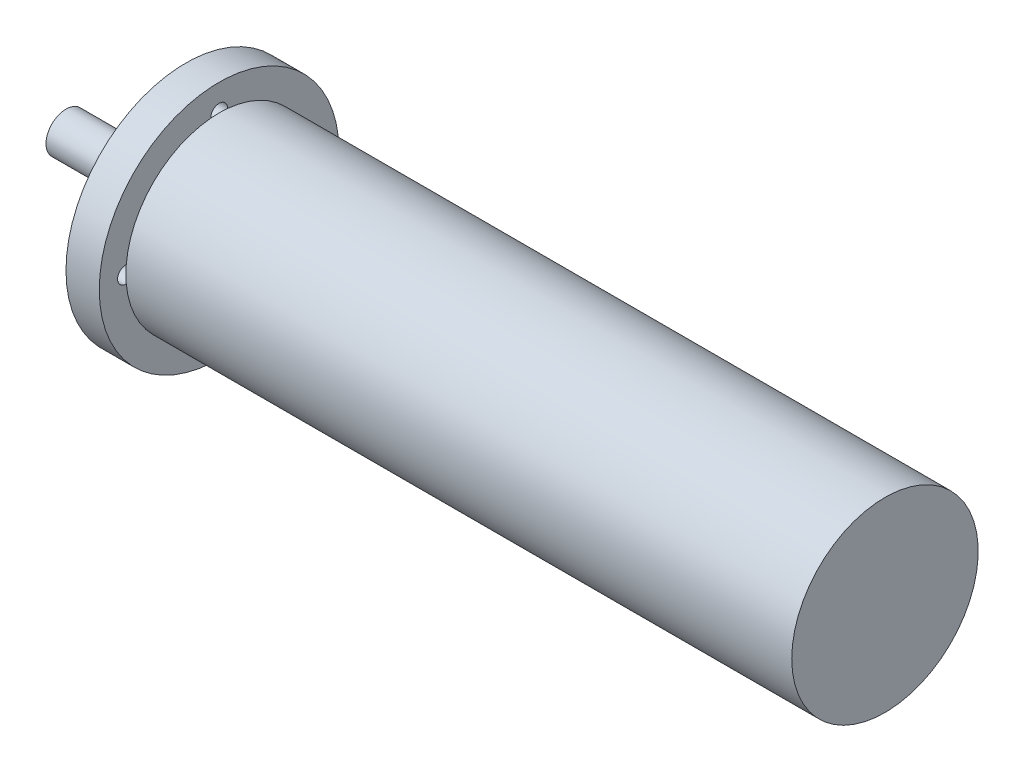
ISO-10303-21;
HEADER;
FILE_DESCRIPTION(('STEP AP214'),'2;1');
FILE_NAME('part.step','',(''),(''),'','','');
FILE_SCHEMA(('AUTOMOTIVE_DESIGN { 1 0 10303 214 1 1 1 1 }'));
ENDSEC;
DATA;
#1=APPLICATION_CONTEXT('core data for automotive mechanical design processes');
#2=APPLICATION_PROTOCOL_DEFINITION('international standard','automotive_design',2000,#1);
#3=PRODUCT_CONTEXT('',#1,'mechanical');
#4=PRODUCT('Part','Part','',(#3));
#5=PRODUCT_RELATED_PRODUCT_CATEGORY('part','',(#4));
#6=PRODUCT_DEFINITION_FORMATION('','',#4);
#7=PRODUCT_DEFINITION_CONTEXT('part definition',#1,'design');
#8=PRODUCT_DEFINITION('design','',#6,#7);
#9=PRODUCT_DEFINITION_SHAPE('','',#8);
#10=(LENGTH_UNIT() NAMED_UNIT(*) SI_UNIT(.MILLI.,.METRE.));
#11=(NAMED_UNIT(*) PLANE_ANGLE_UNIT() SI_UNIT($,.RADIAN.));
#12=(NAMED_UNIT(*) SI_UNIT($,.STERADIAN.) SOLID_ANGLE_UNIT());
#13=UNCERTAINTY_MEASURE_WITH_UNIT(LENGTH_MEASURE(1.E-05),#10,'distance_accuracy_value','');
#14=(GEOMETRIC_REPRESENTATION_CONTEXT(3) GLOBAL_UNCERTAINTY_ASSIGNED_CONTEXT((#13)) GLOBAL_UNIT_ASSIGNED_CONTEXT((#10,
#11,#12)) REPRESENTATION_CONTEXT('',''));
#15=CARTESIAN_POINT('',(0.,0.,0.));
#16=DIRECTION('',(0.,0.,1.));
#17=DIRECTION('',(1.,0.,0.));
#18=AXIS2_PLACEMENT_3D('',#15,#16,#17);
#19=CARTESIAN_POINT('',(0.,3.,0.));
#20=DIRECTION('',(1.,0.,0.));
#21=DIRECTION('',(0.,0.,-1.));
#22=AXIS2_PLACEMENT_3D('',#19,#20,#21);
#23=PLANE('',#22);
#24=CARTESIAN_POINT('',(0.,0.,0.));
#25=DIRECTION('',(-1.,0.,0.));
#26=DIRECTION('',(0.,0.,1.));
#27=AXIS2_PLACEMENT_3D('',#24,#25,#26);
#28=CIRCLE('',#27,3.);
#29=CARTESIAN_POINT('',(0.,0.,3.));
#30=VERTEX_POINT('',#29);
#31=EDGE_CURVE('E136',#30,#30,#28,.T.);
#32=ORIENTED_EDGE('',*,*,#31,.T.);
#33=EDGE_LOOP('',(#32));
#34=FACE_BOUND('',#33,.T.);
#35=ADVANCED_FACE('F33',(#34),#23,.F.);
#36=CARTESIAN_POINT('',(123.,0.,0.));
#37=DIRECTION('',(-1.,0.,0.));
#38=DIRECTION('',(0.,0.,1.));
#39=AXIS2_PLACEMENT_3D('',#36,#37,#38);
#40=PLANE('',#39);
#41=CARTESIAN_POINT('',(123.,0.,0.));
#42=DIRECTION('',(-1.,0.,0.));
#43=DIRECTION('',(0.,0.,1.));
#44=AXIS2_PLACEMENT_3D('',#41,#42,#43);
#45=CIRCLE('',#44,14.);
#46=CARTESIAN_POINT('',(123.,0.,14.));
#47=VERTEX_POINT('',#46);
#48=EDGE_CURVE('E11',#47,#47,#45,.T.);
#49=ORIENTED_EDGE('',*,*,#48,.F.);
#50=EDGE_LOOP('',(#49));
#51=FACE_BOUND('',#50,.T.);
#52=ADVANCED_FACE('F165',(#51),#40,.F.);
#53=CARTESIAN_POINT('',(-16.,0.,0.));
#54=DIRECTION('',(-1.,0.,0.));
#55=DIRECTION('',(0.,0.,1.));
#56=AXIS2_PLACEMENT_3D('',#53,#54,#55);
#57=CYLINDRICAL_SURFACE('',#56,14.);
#58=CARTESIAN_POINT('',(23.,0.,0.));
#59=DIRECTION('',(-1.,0.,0.));
#60=DIRECTION('',(0.,0.,1.));
#61=AXIS2_PLACEMENT_3D('',#58,#59,#60);
#62=CIRCLE('',#61,14.);
#63=CARTESIAN_POINT('',(23.,13.9441964285714,1.24875376332399));
#64=VERTEX_POINT('',#63);
#65=CARTESIAN_POINT('',(23.,13.9441964285714,-1.24875376332398));
#66=VERTEX_POINT('',#65);
#67=EDGE_CURVE('E40',#64,#66,#62,.T.);
#68=ORIENTED_EDGE('',*,*,#67,.F.);
#69=CARTESIAN_POINT('',(23.,1.24875376332398,13.9441964285714));
#70=VERTEX_POINT('',#69);
#71=EDGE_CURVE('E102',#70,#64,#62,.T.);
#72=ORIENTED_EDGE('',*,*,#71,.F.);
#73=CARTESIAN_POINT('',(23.,-1.24875376332398,13.9441964285714));
#74=VERTEX_POINT('',#73);
#75=EDGE_CURVE('E98',#74,#70,#62,.T.);
#76=ORIENTED_EDGE('',*,*,#75,.F.);
#77=CARTESIAN_POINT('',(23.,-13.9441964285714,1.24875376332398));
#78=VERTEX_POINT('',#77);
#79=EDGE_CURVE('E93',#78,#74,#62,.T.);
#80=ORIENTED_EDGE('',*,*,#79,.F.);
#81=CARTESIAN_POINT('',(23.,-13.9441964285714,-1.24875376332399));
#82=VERTEX_POINT('',#81);
#83=EDGE_CURVE('E107',#82,#78,#62,.T.);
#84=ORIENTED_EDGE('',*,*,#83,.F.);
#85=CARTESIAN_POINT('',(23.,-1.24875376332399,-13.9441964285714));
#86=VERTEX_POINT('',#85);
#87=EDGE_CURVE('E92',#86,#82,#62,.T.);
#88=ORIENTED_EDGE('',*,*,#87,.F.);
#89=CARTESIAN_POINT('',(23.,1.24875376332398,-13.9441964285714));
#90=VERTEX_POINT('',#89);
#91=EDGE_CURVE('E74',#90,#86,#62,.T.);
#92=ORIENTED_EDGE('',*,*,#91,.F.);
#93=EDGE_CURVE('E90',#66,#90,#62,.T.);
#94=ORIENTED_EDGE('',*,*,#93,.F.);
#95=EDGE_LOOP('',(#68,#72,#76,#80,#84,#88,#92,#94));
#96=FACE_BOUND('',#95,.T.);
#97=ORIENTED_EDGE('',*,*,#48,.T.);
#98=EDGE_LOOP('',(#97));
#99=FACE_BOUND('',#98,.T.);
#100=ADVANCED_FACE('F88',(#96,#99),#57,.T.);
#101=CARTESIAN_POINT('',(23.,14.,0.));
#102=DIRECTION('',(-1.,0.,0.));
#103=DIRECTION('',(0.,0.,1.));
#104=AXIS2_PLACEMENT_3D('',#101,#102,#103);
#105=PLANE('',#104);
#106=CARTESIAN_POINT('',(23.,0.,0.));
#107=DIRECTION('',(-1.,0.,0.));
#108=DIRECTION('',(0.,0.,1.));
#109=AXIS2_PLACEMENT_3D('',#106,#107,#108);
#110=CIRCLE('',#109,18.);
#111=CARTESIAN_POINT('',(23.,0.,18.));
#112=VERTEX_POINT('',#111);
#113=EDGE_CURVE('E108',#112,#112,#110,.T.);
#114=ORIENTED_EDGE('',*,*,#113,.F.);
#115=EDGE_LOOP('',(#114));
#116=FACE_BOUND('',#115,.T.);
#117=ORIENTED_EDGE('',*,*,#93,.T.);
#118=CARTESIAN_POINT('',(23.,0.,-14.));
#119=DIRECTION('',(-1.,0.,0.));
#120=DIRECTION('',(0.,0.,1.));
#121=AXIS2_PLACEMENT_3D('',#118,#119,#120);
#122=CIRCLE('',#121,1.25);
#123=EDGE_CURVE('E76',#86,#90,#122,.F.);
#124=ORIENTED_EDGE('',*,*,#123,.F.);
#125=ORIENTED_EDGE('',*,*,#87,.T.);
#126=CARTESIAN_POINT('',(23.,-14.,0.));
#127=DIRECTION('',(-1.,0.,0.));
#128=DIRECTION('',(0.,0.,1.));
#129=AXIS2_PLACEMENT_3D('',#126,#127,#128);
#130=CIRCLE('',#129,1.25);
#131=EDGE_CURVE('E114',#78,#82,#130,.F.);
#132=ORIENTED_EDGE('',*,*,#131,.F.);
#133=ORIENTED_EDGE('',*,*,#79,.T.);
#134=CARTESIAN_POINT('',(23.,0.,14.));
#135=DIRECTION('',(-1.,0.,0.));
#136=DIRECTION('',(0.,0.,1.));
#137=AXIS2_PLACEMENT_3D('',#134,#135,#136);
#138=CIRCLE('',#137,1.25);
#139=EDGE_CURVE('E122',#70,#74,#138,.F.);
#140=ORIENTED_EDGE('',*,*,#139,.F.);
#141=ORIENTED_EDGE('',*,*,#71,.T.);
#142=CARTESIAN_POINT('',(23.,14.,0.));
#143=DIRECTION('',(-1.,0.,0.));
#144=DIRECTION('',(0.,0.,1.));
#145=AXIS2_PLACEMENT_3D('',#142,#143,#144);
#146=CIRCLE('',#145,1.25);
#147=EDGE_CURVE('E97',#66,#64,#146,.F.);
#148=ORIENTED_EDGE('',*,*,#147,.F.);
#149=EDGE_LOOP('',(#117,#124,#125,#132,#133,#140,#141,#148));
#150=FACE_BOUND('',#149,.T.);
#151=ADVANCED_FACE('F95',(#116,#150),#105,.F.);
#152=CARTESIAN_POINT('',(-16.,0.,0.));
#153=DIRECTION('',(-1.,0.,0.));
#154=DIRECTION('',(0.,0.,1.));
#155=AXIS2_PLACEMENT_3D('',#152,#153,#154);
#156=CYLINDRICAL_SURFACE('',#155,18.);
#157=CARTESIAN_POINT('',(18.,0.,0.));
#158=DIRECTION('',(-1.,0.,0.));
#159=DIRECTION('',(0.,0.,1.));
#160=AXIS2_PLACEMENT_3D('',#157,#158,#159);
#161=CIRCLE('',#160,18.);
#162=CARTESIAN_POINT('',(18.,0.,18.));
#163=VERTEX_POINT('',#162);
#164=EDGE_CURVE('E111',#163,#163,#161,.T.);
#165=ORIENTED_EDGE('',*,*,#164,.F.);
#166=EDGE_LOOP('',(#165));
#167=FACE_BOUND('',#166,.T.);
#168=ORIENTED_EDGE('',*,*,#113,.T.);
#169=EDGE_LOOP('',(#168));
#170=FACE_BOUND('',#169,.T.);
#171=ADVANCED_FACE('F153',(#167,#170),#156,.T.);
#172=CARTESIAN_POINT('',(18.,18.,0.));
#173=DIRECTION('',(1.,0.,0.));
#174=DIRECTION('',(0.,0.,-1.));
#175=AXIS2_PLACEMENT_3D('',#172,#173,#174);
#176=PLANE('',#175);
#177=CARTESIAN_POINT('',(18.,0.,-14.));
#178=DIRECTION('',(-1.,0.,0.));
#179=DIRECTION('',(0.,0.,1.));
#180=AXIS2_PLACEMENT_3D('',#177,#178,#179);
#181=CIRCLE('',#180,1.25);
#182=CARTESIAN_POINT('',(18.,0.,-12.75));
#183=VERTEX_POINT('',#182);
#184=EDGE_CURVE('E77',#183,#183,#181,.T.);
#185=ORIENTED_EDGE('',*,*,#184,.F.);
#186=EDGE_LOOP('',(#185));
#187=FACE_BOUND('',#186,.T.);
#188=CARTESIAN_POINT('',(18.,-14.,0.));
#189=DIRECTION('',(-1.,0.,0.));
#190=DIRECTION('',(0.,0.,1.));
#191=AXIS2_PLACEMENT_3D('',#188,#189,#190);
#192=CIRCLE('',#191,1.25);
#193=CARTESIAN_POINT('',(18.,-14.,1.25));
#194=VERTEX_POINT('',#193);
#195=EDGE_CURVE('E84',#194,#194,#192,.T.);
#196=ORIENTED_EDGE('',*,*,#195,.F.);
#197=EDGE_LOOP('',(#196));
#198=FACE_BOUND('',#197,.T.);
#199=CARTESIAN_POINT('',(18.,0.,14.));
#200=DIRECTION('',(-1.,0.,0.));
#201=DIRECTION('',(0.,0.,1.));
#202=AXIS2_PLACEMENT_3D('',#199,#200,#201);
#203=CIRCLE('',#202,1.25);
#204=CARTESIAN_POINT('',(18.,0.,15.25));
#205=VERTEX_POINT('',#204);
#206=EDGE_CURVE('E120',#205,#205,#203,.T.);
#207=ORIENTED_EDGE('',*,*,#206,.F.);
#208=EDGE_LOOP('',(#207));
#209=FACE_BOUND('',#208,.T.);
#210=CARTESIAN_POINT('',(18.,14.,0.));
#211=DIRECTION('',(-1.,0.,0.));
#212=DIRECTION('',(0.,0.,1.));
#213=AXIS2_PLACEMENT_3D('',#210,#211,#212);
#214=CIRCLE('',#213,1.25);
#215=CARTESIAN_POINT('',(18.,14.,1.25));
#216=VERTEX_POINT('',#215);
#217=EDGE_CURVE('E129',#216,#216,#214,.T.);
#218=ORIENTED_EDGE('',*,*,#217,.F.);
#219=EDGE_LOOP('',(#218));
#220=FACE_BOUND('',#219,.T.);
#221=CARTESIAN_POINT('',(18.,0.,0.));
#222=DIRECTION('',(-1.,0.,0.));
#223=DIRECTION('',(0.,0.,1.));
#224=AXIS2_PLACEMENT_3D('',#221,#222,#223);
#225=CIRCLE('',#224,11.);
#226=CARTESIAN_POINT('',(18.,0.,11.));
#227=VERTEX_POINT('',#226);
#228=EDGE_CURVE('E145',#227,#227,#225,.T.);
#229=ORIENTED_EDGE('',*,*,#228,.F.);
#230=EDGE_LOOP('',(#229));
#231=FACE_BOUND('',#230,.T.);
#232=ORIENTED_EDGE('',*,*,#164,.T.);
#233=EDGE_LOOP('',(#232));
#234=FACE_BOUND('',#233,.T.);
#235=ADVANCED_FACE('F151',(#187,#198,#209,#220,#231,#234),#176,.F.);
#236=CARTESIAN_POINT('',(-16.,0.,0.));
#237=DIRECTION('',(-1.,0.,0.));
#238=DIRECTION('',(0.,0.,1.));
#239=AXIS2_PLACEMENT_3D('',#236,#237,#238);
#240=CYLINDRICAL_SURFACE('',#239,11.);
#241=CARTESIAN_POINT('',(16.,0.,0.));
#242=DIRECTION('',(-1.,0.,0.));
#243=DIRECTION('',(0.,0.,1.));
#244=AXIS2_PLACEMENT_3D('',#241,#242,#243);
#245=CIRCLE('',#244,11.);
#246=CARTESIAN_POINT('',(16.,0.,11.));
#247=VERTEX_POINT('',#246);
#248=EDGE_CURVE('E142',#247,#247,#245,.T.);
#249=ORIENTED_EDGE('',*,*,#248,.F.);
#250=EDGE_LOOP('',(#249));
#251=FACE_BOUND('',#250,.T.);
#252=ORIENTED_EDGE('',*,*,#228,.T.);
#253=EDGE_LOOP('',(#252));
#254=FACE_BOUND('',#253,.T.);
#255=ADVANCED_FACE('F185',(#251,#254),#240,.T.);
#256=CARTESIAN_POINT('',(16.,11.,0.));
#257=DIRECTION('',(1.,0.,0.));
#258=DIRECTION('',(0.,0.,-1.));
#259=AXIS2_PLACEMENT_3D('',#256,#257,#258);
#260=PLANE('',#259);
#261=CARTESIAN_POINT('',(16.,0.,0.));
#262=DIRECTION('',(-1.,0.,0.));
#263=DIRECTION('',(0.,0.,1.));
#264=AXIS2_PLACEMENT_3D('',#261,#262,#263);
#265=CIRCLE('',#264,3.);
#266=CARTESIAN_POINT('',(16.,0.,3.));
#267=VERTEX_POINT('',#266);
#268=EDGE_CURVE('E139',#267,#267,#265,.T.);
#269=ORIENTED_EDGE('',*,*,#268,.F.);
#270=EDGE_LOOP('',(#269));
#271=FACE_BOUND('',#270,.T.);
#272=ORIENTED_EDGE('',*,*,#248,.T.);
#273=EDGE_LOOP('',(#272));
#274=FACE_BOUND('',#273,.T.);
#275=ADVANCED_FACE('F179',(#271,#274),#260,.F.);
#276=CARTESIAN_POINT('',(-16.,0.,0.));
#277=DIRECTION('',(-1.,0.,0.));
#278=DIRECTION('',(0.,0.,1.));
#279=AXIS2_PLACEMENT_3D('',#276,#277,#278);
#280=CYLINDRICAL_SURFACE('',#279,3.);
#281=ORIENTED_EDGE('',*,*,#31,.F.);
#282=EDGE_LOOP('',(#281));
#283=FACE_BOUND('',#282,.T.);
#284=ORIENTED_EDGE('',*,*,#268,.T.);
#285=EDGE_LOOP('',(#284));
#286=FACE_BOUND('',#285,.T.);
#287=ADVANCED_FACE('F175',(#283,#286),#280,.T.);
#288=CARTESIAN_POINT('',(23.,14.,0.));
#289=DIRECTION('',(-1.,0.,0.));
#290=DIRECTION('',(0.,0.,1.));
#291=AXIS2_PLACEMENT_3D('',#288,#289,#290);
#292=PLANE('',#291);
#293=ORIENTED_EDGE('',*,*,#67,.T.);
#294=EDGE_CURVE('E134',#64,#66,#146,.F.);
#295=ORIENTED_EDGE('',*,*,#294,.F.);
#296=EDGE_LOOP('',(#293,#295));
#297=FACE_BOUND('',#296,.T.);
#298=ADVANCED_FACE('F178',(#297),#292,.T.);
#299=CARTESIAN_POINT('',(26.5355339059327,14.,0.));
#300=DIRECTION('',(-1.,0.,0.));
#301=DIRECTION('',(0.,0.,1.));
#302=AXIS2_PLACEMENT_3D('',#299,#300,#301);
#303=CYLINDRICAL_SURFACE('',#302,1.25);
#304=ORIENTED_EDGE('',*,*,#294,.T.);
#305=ORIENTED_EDGE('',*,*,#147,.T.);
#306=EDGE_LOOP('',(#304,#305));
#307=FACE_BOUND('',#306,.T.);
#308=ORIENTED_EDGE('',*,*,#217,.T.);
#309=EDGE_LOOP('',(#308));
#310=FACE_BOUND('',#309,.T.);
#311=ADVANCED_FACE('F202',(#307,#310),#303,.F.);
#312=CARTESIAN_POINT('',(23.,14.,0.));
#313=DIRECTION('',(-1.,0.,0.));
#314=DIRECTION('',(0.,0.,1.));
#315=AXIS2_PLACEMENT_3D('',#312,#313,#314);
#316=PLANE('',#315);
#317=ORIENTED_EDGE('',*,*,#75,.T.);
#318=EDGE_CURVE('E126',#74,#70,#138,.F.);
#319=ORIENTED_EDGE('',*,*,#318,.F.);
#320=EDGE_LOOP('',(#317,#319));
#321=FACE_BOUND('',#320,.T.);
#322=ADVANCED_FACE('F128',(#321),#316,.T.);
#323=CARTESIAN_POINT('',(26.5355339059327,0.,14.));
#324=DIRECTION('',(-1.,0.,0.));
#325=DIRECTION('',(0.,0.,1.));
#326=AXIS2_PLACEMENT_3D('',#323,#324,#325);
#327=CYLINDRICAL_SURFACE('',#326,1.25);
#328=ORIENTED_EDGE('',*,*,#318,.T.);
#329=ORIENTED_EDGE('',*,*,#139,.T.);
#330=EDGE_LOOP('',(#328,#329));
#331=FACE_BOUND('',#330,.T.);
#332=ORIENTED_EDGE('',*,*,#206,.T.);
#333=EDGE_LOOP('',(#332));
#334=FACE_BOUND('',#333,.T.);
#335=ADVANCED_FACE('F124',(#331,#334),#327,.F.);
#336=CARTESIAN_POINT('',(23.,14.,0.));
#337=DIRECTION('',(-1.,0.,0.));
#338=DIRECTION('',(0.,0.,1.));
#339=AXIS2_PLACEMENT_3D('',#336,#337,#338);
#340=PLANE('',#339);
#341=ORIENTED_EDGE('',*,*,#83,.T.);
#342=EDGE_CURVE('E53',#82,#78,#130,.F.);
#343=ORIENTED_EDGE('',*,*,#342,.F.);
#344=EDGE_LOOP('',(#341,#343));
#345=FACE_BOUND('',#344,.T.);
#346=ADVANCED_FACE('F119',(#345),#340,.T.);
#347=CARTESIAN_POINT('',(26.5355339059327,-14.,0.));
#348=DIRECTION('',(-1.,0.,0.));
#349=DIRECTION('',(0.,0.,1.));
#350=AXIS2_PLACEMENT_3D('',#347,#348,#349);
#351=CYLINDRICAL_SURFACE('',#350,1.25);
#352=ORIENTED_EDGE('',*,*,#342,.T.);
#353=ORIENTED_EDGE('',*,*,#131,.T.);
#354=EDGE_LOOP('',(#352,#353));
#355=FACE_BOUND('',#354,.T.);
#356=ORIENTED_EDGE('',*,*,#195,.T.);
#357=EDGE_LOOP('',(#356));
#358=FACE_BOUND('',#357,.T.);
#359=ADVANCED_FACE('F116',(#355,#358),#351,.F.);
#360=CARTESIAN_POINT('',(23.,14.,0.));
#361=DIRECTION('',(-1.,0.,0.));
#362=DIRECTION('',(0.,0.,1.));
#363=AXIS2_PLACEMENT_3D('',#360,#361,#362);
#364=PLANE('',#363);
#365=ORIENTED_EDGE('',*,*,#91,.T.);
#366=EDGE_CURVE('E46',#90,#86,#122,.F.);
#367=ORIENTED_EDGE('',*,*,#366,.F.);
#368=EDGE_LOOP('',(#365,#367));
#369=FACE_BOUND('',#368,.T.);
#370=ADVANCED_FACE('F72',(#369),#364,.T.);
#371=CARTESIAN_POINT('',(26.5355339059327,0.,-14.));
#372=DIRECTION('',(-1.,0.,0.));
#373=DIRECTION('',(0.,0.,1.));
#374=AXIS2_PLACEMENT_3D('',#371,#372,#373);
#375=CYLINDRICAL_SURFACE('',#374,1.25);
#376=ORIENTED_EDGE('',*,*,#123,.T.);
#377=ORIENTED_EDGE('',*,*,#366,.T.);
#378=EDGE_LOOP('',(#376,#377));
#379=FACE_BOUND('',#378,.T.);
#380=ORIENTED_EDGE('',*,*,#184,.T.);
#381=EDGE_LOOP('',(#380));
#382=FACE_BOUND('',#381,.T.);
#383=ADVANCED_FACE('F79',(#379,#382),#375,.F.);
#384=CLOSED_SHELL('',(#35,#52,#100,#151,#171,#235,#255,#275,#287,#298,#311,#322,#335,#346,#359,
#370,#383));
#385=MANIFOLD_SOLID_BREP('B2',#384);
#386=ADVANCED_BREP_SHAPE_REPRESENTATION('',(#18,#385),#14);
#387=SHAPE_DEFINITION_REPRESENTATION(#9,#386);
ENDSEC;
END-ISO-10303-21;
